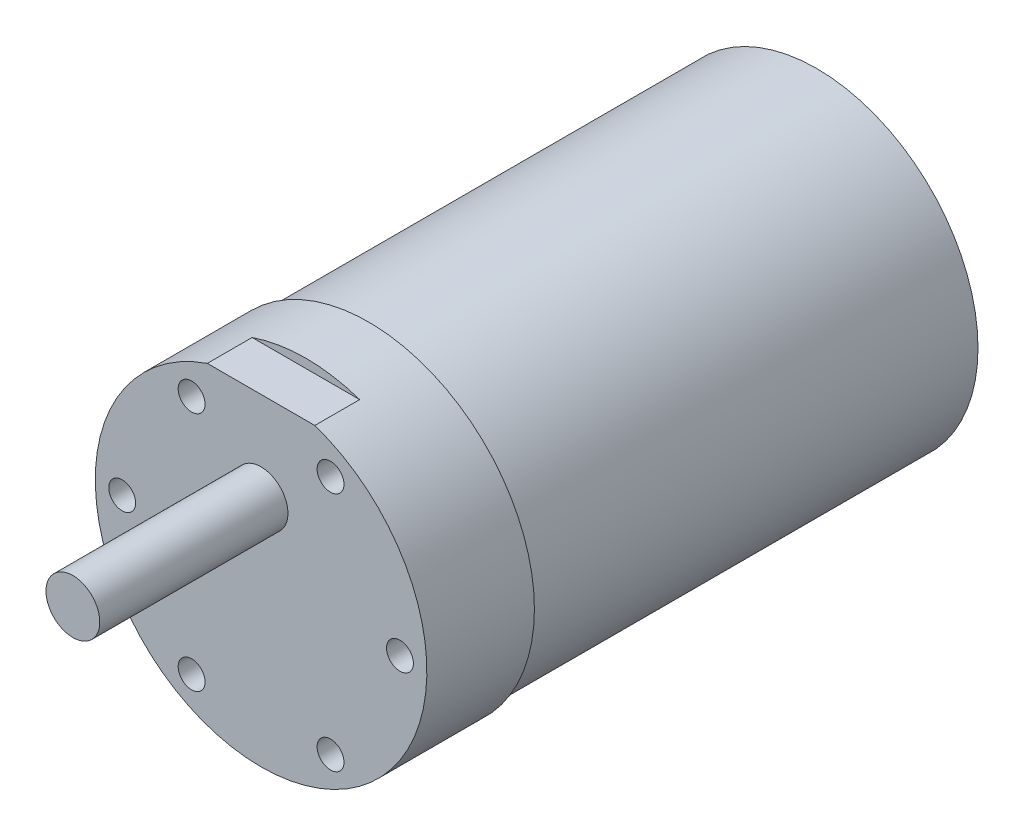
ISO-10303-21;
HEADER;
FILE_DESCRIPTION(('STEP AP214'),'2;1');
FILE_NAME('part.step','',(''),(''),'','','');
FILE_SCHEMA(('AUTOMOTIVE_DESIGN { 1 0 10303 214 1 1 1 1 }'));
ENDSEC;
DATA;
#1=APPLICATION_CONTEXT('core data for automotive mechanical design processes');
#2=APPLICATION_PROTOCOL_DEFINITION('international standard','automotive_design',2000,#1);
#3=PRODUCT_CONTEXT('',#1,'mechanical');
#4=PRODUCT('Part','Part','',(#3));
#5=PRODUCT_RELATED_PRODUCT_CATEGORY('part','',(#4));
#6=PRODUCT_DEFINITION_FORMATION('','',#4);
#7=PRODUCT_DEFINITION_CONTEXT('part definition',#1,'design');
#8=PRODUCT_DEFINITION('design','',#6,#7);
#9=PRODUCT_DEFINITION_SHAPE('','',#8);
#10=(LENGTH_UNIT() NAMED_UNIT(*) SI_UNIT(.MILLI.,.METRE.));
#11=(NAMED_UNIT(*) PLANE_ANGLE_UNIT() SI_UNIT($,.RADIAN.));
#12=(NAMED_UNIT(*) SI_UNIT($,.STERADIAN.) SOLID_ANGLE_UNIT());
#13=UNCERTAINTY_MEASURE_WITH_UNIT(LENGTH_MEASURE(1.E-05),#10,'distance_accuracy_value','');
#14=(GEOMETRIC_REPRESENTATION_CONTEXT(3) GLOBAL_UNCERTAINTY_ASSIGNED_CONTEXT((#13)) GLOBAL_UNIT_ASSIGNED_CONTEXT((#10,
#11,#12)) REPRESENTATION_CONTEXT('',''));
#15=CARTESIAN_POINT('',(0.,0.,0.));
#16=DIRECTION('',(0.,0.,1.));
#17=DIRECTION('',(1.,0.,0.));
#18=AXIS2_PLACEMENT_3D('',#15,#16,#17);
#19=CARTESIAN_POINT('',(6.10211523040816,32.8501846464901,8.33257732777867));
#20=DIRECTION('',(0.,0.,1.));
#21=DIRECTION('',(1.,0.,0.));
#22=AXIS2_PLACEMENT_3D('',#19,#20,#21);
#23=PLANE('',#22);
#24=DIRECTION('',(1.,0.,0.));
#25=VECTOR('',#24,1.);
#26=CARTESIAN_POINT('',(0.732253827648978,48.2501846464901,8.33257732777867));
#27=LINE('',#26,#25);
#28=CARTESIAN_POINT('',(0.822115230408154,48.2501846464901,8.33257732777867));
#29=VERTEX_POINT('',#28);
#30=CARTESIAN_POINT('',(11.3821152304082,48.2501846464901,8.33257732777867));
#31=VERTEX_POINT('',#30);
#32=EDGE_CURVE('E66',#29,#31,#27,.T.);
#33=ORIENTED_EDGE('',*,*,#32,.F.);
#34=CARTESIAN_POINT('',(6.10211523040816,32.8501846464901,8.33257732777867));
#35=DIRECTION('',(0.,0.,1.));
#36=DIRECTION('',(1.,0.,0.));
#37=AXIS2_PLACEMENT_3D('',#34,#35,#36);
#38=CIRCLE('',#37,16.28);
#39=EDGE_CURVE('E44',#29,#31,#38,.T.);
#40=ORIENTED_EDGE('',*,*,#39,.T.);
#41=EDGE_LOOP('',(#33,#40));
#42=FACE_BOUND('',#41,.T.);
#43=CARTESIAN_POINT('',(6.10211523040816,39.4501846464901,8.33257732777867));
#44=DIRECTION('',(0.,0.,1.));
#45=DIRECTION('',(1.,0.,0.));
#46=AXIS2_PLACEMENT_3D('',#43,#44,#45);
#47=CIRCLE('',#46,2.64);
#48=CARTESIAN_POINT('',(3.46211523040816,39.4501846464901,8.33257732777866));
#49=VERTEX_POINT('',#48);
#50=EDGE_CURVE('E119',#49,#49,#47,.T.);
#51=ORIENTED_EDGE('',*,*,#50,.F.);
#52=EDGE_LOOP('',(#51));
#53=FACE_BOUND('',#52,.T.);
#54=CARTESIAN_POINT('',(12.9221152304083,44.6627711541098,8.33257732777867));
#55=DIRECTION('',(0.,0.,1.));
#56=DIRECTION('',(1.,0.,0.));
#57=AXIS2_PLACEMENT_3D('',#54,#55,#56);
#58=CIRCLE('',#57,1.32);
#59=CARTESIAN_POINT('',(14.2421152304083,44.6627711541098,8.33257732777867));
#60=VERTEX_POINT('',#59);
#61=EDGE_CURVE('E107',#60,#60,#58,.T.);
#62=ORIENTED_EDGE('',*,*,#61,.F.);
#63=EDGE_LOOP('',(#62));
#64=FACE_BOUND('',#63,.T.);
#65=CARTESIAN_POINT('',(-7.53788476959184,32.8501846464902,8.33257732777867));
#66=DIRECTION('',(0.,0.,1.));
#67=DIRECTION('',(1.,0.,0.));
#68=AXIS2_PLACEMENT_3D('',#65,#66,#67);
#69=CIRCLE('',#68,1.32);
#70=CARTESIAN_POINT('',(-6.21788476959184,32.8501846464902,8.33257732777867));
#71=VERTEX_POINT('',#70);
#72=EDGE_CURVE('E95',#71,#71,#69,.T.);
#73=ORIENTED_EDGE('',*,*,#72,.F.);
#74=EDGE_LOOP('',(#73));
#75=FACE_BOUND('',#74,.T.);
#76=CARTESIAN_POINT('',(12.9221152304081,21.0375981388703,8.33257732777867));
#77=DIRECTION('',(0.,0.,1.));
#78=DIRECTION('',(1.,0.,0.));
#79=AXIS2_PLACEMENT_3D('',#76,#77,#78);
#80=CIRCLE('',#79,1.32);
#81=CARTESIAN_POINT('',(14.2421152304081,21.0375981388703,8.33257732777867));
#82=VERTEX_POINT('',#81);
#83=EDGE_CURVE('E83',#82,#82,#80,.T.);
#84=ORIENTED_EDGE('',*,*,#83,.F.);
#85=EDGE_LOOP('',(#84));
#86=FACE_BOUND('',#85,.T.);
#87=CARTESIAN_POINT('',(19.7421152304082,32.8501846464901,8.33257732777867));
#88=DIRECTION('',(0.,0.,1.));
#89=DIRECTION('',(1.,0.,0.));
#90=AXIS2_PLACEMENT_3D('',#87,#88,#89);
#91=CIRCLE('',#90,1.32);
#92=CARTESIAN_POINT('',(21.0621152304082,32.8501846464901,8.33257732777867));
#93=VERTEX_POINT('',#92);
#94=EDGE_CURVE('E78',#93,#93,#91,.T.);
#95=ORIENTED_EDGE('',*,*,#94,.F.);
#96=EDGE_LOOP('',(#95));
#97=FACE_BOUND('',#96,.T.);
#98=CARTESIAN_POINT('',(-0.7178847695919,21.0375981388704,8.33257732777867));
#99=DIRECTION('',(0.,0.,1.));
#100=DIRECTION('',(1.,0.,0.));
#101=AXIS2_PLACEMENT_3D('',#98,#99,#100);
#102=CIRCLE('',#101,1.32);
#103=CARTESIAN_POINT('',(0.602115230408101,21.0375981388704,8.33257732777867));
#104=VERTEX_POINT('',#103);
#105=EDGE_CURVE('E89',#104,#104,#102,.T.);
#106=ORIENTED_EDGE('',*,*,#105,.F.);
#107=EDGE_LOOP('',(#106));
#108=FACE_BOUND('',#107,.T.);
#109=CARTESIAN_POINT('',(-0.717884769591742,44.6627711541099,8.33257732777867));
#110=DIRECTION('',(0.,0.,1.));
#111=DIRECTION('',(1.,0.,0.));
#112=AXIS2_PLACEMENT_3D('',#109,#110,#111);
#113=CIRCLE('',#112,1.32);
#114=CARTESIAN_POINT('',(0.602115230408256,44.6627711541099,8.33257732777867));
#115=VERTEX_POINT('',#114);
#116=EDGE_CURVE('E101',#115,#115,#113,.T.);
#117=ORIENTED_EDGE('',*,*,#116,.F.);
#118=EDGE_LOOP('',(#117));
#119=FACE_BOUND('',#118,.T.);
#120=ADVANCED_FACE('F35',(#42,#53,#64,#75,#86,#97,#108,#119),#23,.T.);
#121=CARTESIAN_POINT('',(6.10211523040816,32.8501846464901,-2.22742267222134));
#122=DIRECTION('',(0.,0.,1.));
#123=DIRECTION('',(1.,0.,0.));
#124=AXIS2_PLACEMENT_3D('',#121,#122,#123);
#125=PLANE('',#124);
#126=CARTESIAN_POINT('',(6.10211523040816,32.8501846464901,-2.22742267222134));
#127=DIRECTION('',(0.,0.,-1.));
#128=DIRECTION('',(-1.,0.,0.));
#129=AXIS2_PLACEMENT_3D('',#126,#127,#128);
#130=CIRCLE('',#129,15.84);
#131=CARTESIAN_POINT('',(-9.73788476959184,32.8501846464901,-2.22742267222134));
#132=VERTEX_POINT('',#131);
#133=EDGE_CURVE('E11',#132,#132,#130,.T.);
#134=ORIENTED_EDGE('',*,*,#133,.F.);
#135=EDGE_LOOP('',(#134));
#136=FACE_BOUND('',#135,.T.);
#137=CARTESIAN_POINT('',(6.10211523040816,32.8501846464901,-2.22742267222134));
#138=DIRECTION('',(0.,0.,1.));
#139=DIRECTION('',(1.,0.,0.));
#140=AXIS2_PLACEMENT_3D('',#137,#138,#139);
#141=CIRCLE('',#140,16.28);
#142=CARTESIAN_POINT('',(22.3821152304082,32.8501846464901,-2.22742267222134));
#143=VERTEX_POINT('',#142);
#144=EDGE_CURVE('E39',#143,#143,#141,.T.);
#145=ORIENTED_EDGE('',*,*,#144,.F.);
#146=EDGE_LOOP('',(#145));
#147=FACE_BOUND('',#146,.T.);
#148=ADVANCED_FACE('F138',(#136,#147),#125,.F.);
#149=CARTESIAN_POINT('',(6.10211523040816,32.8501846464901,8.33257732777867));
#150=DIRECTION('',(0.,0.,-1.));
#151=DIRECTION('',(-1.,0.,0.));
#152=AXIS2_PLACEMENT_3D('',#149,#150,#151);
#153=CYLINDRICAL_SURFACE('',#152,16.28);
#154=ORIENTED_EDGE('',*,*,#39,.F.);
#155=DIRECTION('',(0.,0.,1.));
#156=VECTOR('',#155,1.);
#157=CARTESIAN_POINT('',(0.822115230408154,48.2501846464901,3.93257732777866));
#158=LINE('',#157,#156);
#159=CARTESIAN_POINT('',(0.822115230408154,48.2501846464901,3.93257732777866));
#160=VERTEX_POINT('',#159);
#161=EDGE_CURVE('E63',#160,#29,#158,.T.);
#162=ORIENTED_EDGE('',*,*,#161,.F.);
#163=CARTESIAN_POINT('',(6.10211523040816,32.8501846464901,3.93257732777866));
#164=DIRECTION('',(0.,0.,1.));
#165=DIRECTION('',(1.,0.,0.));
#166=AXIS2_PLACEMENT_3D('',#163,#164,#165);
#167=CIRCLE('',#166,16.28);
#168=CARTESIAN_POINT('',(11.3821152304082,48.2501846464901,3.93257732777866));
#169=VERTEX_POINT('',#168);
#170=EDGE_CURVE('E56',#169,#160,#167,.T.);
#171=ORIENTED_EDGE('',*,*,#170,.F.);
#172=DIRECTION('',(0.,0.,1.));
#173=VECTOR('',#172,1.);
#174=CARTESIAN_POINT('',(11.3821152304082,48.2501846464901,3.93257732777866));
#175=LINE('',#174,#173);
#176=EDGE_CURVE('E70',#169,#31,#175,.T.);
#177=ORIENTED_EDGE('',*,*,#176,.T.);
#178=EDGE_LOOP('',(#154,#162,#171,#177));
#179=FACE_BOUND('',#178,.T.);
#180=ORIENTED_EDGE('',*,*,#144,.T.);
#181=EDGE_LOOP('',(#180));
#182=FACE_BOUND('',#181,.T.);
#183=ADVANCED_FACE('F37',(#179,#182),#153,.T.);
#184=CARTESIAN_POINT('',(19.7421152304082,32.8501846464901,8.33257732777867));
#185=DIRECTION('',(0.,0.,-1.));
#186=DIRECTION('',(-1.,0.,0.));
#187=AXIS2_PLACEMENT_3D('',#184,#185,#186);
#188=CYLINDRICAL_SURFACE('',#187,1.32);
#189=ORIENTED_EDGE('',*,*,#94,.T.);
#190=EDGE_LOOP('',(#189));
#191=FACE_BOUND('',#190,.T.);
#192=CARTESIAN_POINT('',(19.7421152304082,32.8501846464901,-2.22742267222134));
#193=DIRECTION('',(0.,0.,1.));
#194=DIRECTION('',(1.,0.,0.));
#195=AXIS2_PLACEMENT_3D('',#192,#193,#194);
#196=CIRCLE('',#195,1.32);
#197=CARTESIAN_POINT('',(21.0621152304082,32.8501846464901,-2.22742267222134));
#198=VERTEX_POINT('',#197);
#199=EDGE_CURVE('E80',#198,#198,#196,.T.);
#200=ORIENTED_EDGE('',*,*,#199,.F.);
#201=EDGE_LOOP('',(#200));
#202=FACE_BOUND('',#201,.T.);
#203=ADVANCED_FACE('F195',(#191,#202),#188,.F.);
#204=CARTESIAN_POINT('',(12.9221152304081,21.0375981388703,8.33257732777867));
#205=DIRECTION('',(0.,0.,-1.));
#206=DIRECTION('',(-1.,0.,0.));
#207=AXIS2_PLACEMENT_3D('',#204,#205,#206);
#208=CYLINDRICAL_SURFACE('',#207,1.32);
#209=ORIENTED_EDGE('',*,*,#83,.T.);
#210=EDGE_LOOP('',(#209));
#211=FACE_BOUND('',#210,.T.);
#212=CARTESIAN_POINT('',(12.9221152304081,21.0375981388703,-2.22742267222134));
#213=DIRECTION('',(0.,0.,1.));
#214=DIRECTION('',(1.,0.,0.));
#215=AXIS2_PLACEMENT_3D('',#212,#213,#214);
#216=CIRCLE('',#215,1.32);
#217=CARTESIAN_POINT('',(14.2421152304081,21.0375981388703,-2.22742267222134));
#218=VERTEX_POINT('',#217);
#219=EDGE_CURVE('E86',#218,#218,#216,.T.);
#220=ORIENTED_EDGE('',*,*,#219,.F.);
#221=EDGE_LOOP('',(#220));
#222=FACE_BOUND('',#221,.T.);
#223=ADVANCED_FACE('F191',(#211,#222),#208,.F.);
#224=CARTESIAN_POINT('',(-0.7178847695919,21.0375981388704,8.33257732777867));
#225=DIRECTION('',(0.,0.,-1.));
#226=DIRECTION('',(-1.,0.,0.));
#227=AXIS2_PLACEMENT_3D('',#224,#225,#226);
#228=CYLINDRICAL_SURFACE('',#227,1.32);
#229=ORIENTED_EDGE('',*,*,#105,.T.);
#230=EDGE_LOOP('',(#229));
#231=FACE_BOUND('',#230,.T.);
#232=CARTESIAN_POINT('',(-0.7178847695919,21.0375981388704,-2.22742267222134));
#233=DIRECTION('',(0.,0.,1.));
#234=DIRECTION('',(1.,0.,0.));
#235=AXIS2_PLACEMENT_3D('',#232,#233,#234);
#236=CIRCLE('',#235,1.32);
#237=CARTESIAN_POINT('',(0.602115230408101,21.0375981388704,-2.22742267222134));
#238=VERTEX_POINT('',#237);
#239=EDGE_CURVE('E92',#238,#238,#236,.T.);
#240=ORIENTED_EDGE('',*,*,#239,.F.);
#241=EDGE_LOOP('',(#240));
#242=FACE_BOUND('',#241,.T.);
#243=ADVANCED_FACE('F187',(#231,#242),#228,.F.);
#244=CARTESIAN_POINT('',(-7.53788476959184,32.8501846464902,8.33257732777867));
#245=DIRECTION('',(0.,0.,-1.));
#246=DIRECTION('',(-1.,0.,0.));
#247=AXIS2_PLACEMENT_3D('',#244,#245,#246);
#248=CYLINDRICAL_SURFACE('',#247,1.32);
#249=ORIENTED_EDGE('',*,*,#72,.T.);
#250=EDGE_LOOP('',(#249));
#251=FACE_BOUND('',#250,.T.);
#252=CARTESIAN_POINT('',(-7.53788476959184,32.8501846464902,-2.22742267222134));
#253=DIRECTION('',(0.,0.,1.));
#254=DIRECTION('',(1.,0.,0.));
#255=AXIS2_PLACEMENT_3D('',#252,#253,#254);
#256=CIRCLE('',#255,1.32);
#257=CARTESIAN_POINT('',(-6.21788476959184,32.8501846464902,-2.22742267222134));
#258=VERTEX_POINT('',#257);
#259=EDGE_CURVE('E98',#258,#258,#256,.T.);
#260=ORIENTED_EDGE('',*,*,#259,.F.);
#261=EDGE_LOOP('',(#260));
#262=FACE_BOUND('',#261,.T.);
#263=ADVANCED_FACE('F156',(#251,#262),#248,.F.);
#264=CARTESIAN_POINT('',(-0.717884769591742,44.6627711541099,8.33257732777867));
#265=DIRECTION('',(0.,0.,-1.));
#266=DIRECTION('',(-1.,0.,0.));
#267=AXIS2_PLACEMENT_3D('',#264,#265,#266);
#268=CYLINDRICAL_SURFACE('',#267,1.32);
#269=ORIENTED_EDGE('',*,*,#116,.T.);
#270=EDGE_LOOP('',(#269));
#271=FACE_BOUND('',#270,.T.);
#272=CARTESIAN_POINT('',(-0.717884769591742,44.6627711541099,-2.22742267222134));
#273=DIRECTION('',(0.,0.,1.));
#274=DIRECTION('',(1.,0.,0.));
#275=AXIS2_PLACEMENT_3D('',#272,#273,#274);
#276=CIRCLE('',#275,1.32);
#277=CARTESIAN_POINT('',(0.602115230408256,44.6627711541099,-2.22742267222134));
#278=VERTEX_POINT('',#277);
#279=EDGE_CURVE('E104',#278,#278,#276,.T.);
#280=ORIENTED_EDGE('',*,*,#279,.F.);
#281=EDGE_LOOP('',(#280));
#282=FACE_BOUND('',#281,.T.);
#283=ADVANCED_FACE('F152',(#271,#282),#268,.F.);
#284=CARTESIAN_POINT('',(12.9221152304083,44.6627711541098,8.33257732777867));
#285=DIRECTION('',(0.,0.,-1.));
#286=DIRECTION('',(-1.,0.,0.));
#287=AXIS2_PLACEMENT_3D('',#284,#285,#286);
#288=CYLINDRICAL_SURFACE('',#287,1.32);
#289=ORIENTED_EDGE('',*,*,#61,.T.);
#290=EDGE_LOOP('',(#289));
#291=FACE_BOUND('',#290,.T.);
#292=CARTESIAN_POINT('',(12.9221152304083,44.6627711541098,-2.22742267222134));
#293=DIRECTION('',(0.,0.,1.));
#294=DIRECTION('',(1.,0.,0.));
#295=AXIS2_PLACEMENT_3D('',#292,#293,#294);
#296=CIRCLE('',#295,1.32);
#297=CARTESIAN_POINT('',(14.2421152304083,44.6627711541098,-2.22742267222134));
#298=VERTEX_POINT('',#297);
#299=EDGE_CURVE('E110',#298,#298,#296,.T.);
#300=ORIENTED_EDGE('',*,*,#299,.F.);
#301=EDGE_LOOP('',(#300));
#302=FACE_BOUND('',#301,.T.);
#303=ADVANCED_FACE('F155',(#291,#302),#288,.F.);
#304=CARTESIAN_POINT('',(6.10211523040816,32.8501846464901,-46.2274226722213));
#305=DIRECTION('',(0.,0.,-1.));
#306=DIRECTION('',(-1.,0.,0.));
#307=AXIS2_PLACEMENT_3D('',#304,#305,#306);
#308=PLANE('',#307);
#309=CARTESIAN_POINT('',(6.10211523040816,32.8501846464901,-46.2274226722213));
#310=DIRECTION('',(0.,0.,-1.));
#311=DIRECTION('',(-1.,0.,0.));
#312=AXIS2_PLACEMENT_3D('',#309,#310,#311);
#313=CIRCLE('',#312,15.84);
#314=CARTESIAN_POINT('',(-9.73788476959184,32.8501846464901,-46.2274226722213));
#315=VERTEX_POINT('',#314);
#316=EDGE_CURVE('E113',#315,#315,#313,.T.);
#317=ORIENTED_EDGE('',*,*,#316,.T.);
#318=EDGE_LOOP('',(#317));
#319=FACE_BOUND('',#318,.T.);
#320=ADVANCED_FACE('F178',(#319),#308,.T.);
#321=CARTESIAN_POINT('',(6.10211523040816,32.8501846464901,-46.2274226722213));
#322=DIRECTION('',(0.,0.,1.));
#323=DIRECTION('',(1.,0.,0.));
#324=AXIS2_PLACEMENT_3D('',#321,#322,#323);
#325=CYLINDRICAL_SURFACE('',#324,15.84);
#326=ORIENTED_EDGE('',*,*,#316,.F.);
#327=EDGE_LOOP('',(#326));
#328=FACE_BOUND('',#327,.T.);
#329=ORIENTED_EDGE('',*,*,#133,.T.);
#330=EDGE_LOOP('',(#329));
#331=FACE_BOUND('',#330,.T.);
#332=ADVANCED_FACE('F171',(#328,#331),#325,.T.);
#333=CARTESIAN_POINT('',(6.10211523040816,32.8501846464901,-2.22742267222134));
#334=DIRECTION('',(0.,0.,-1.));
#335=DIRECTION('',(-1.,0.,0.));
#336=AXIS2_PLACEMENT_3D('',#333,#334,#335);
#337=PLANE('',#336);
#338=ORIENTED_EDGE('',*,*,#299,.T.);
#339=EDGE_LOOP('',(#338));
#340=FACE_BOUND('',#339,.T.);
#341=ADVANCED_FACE('F163',(#340),#337,.F.);
#342=ORIENTED_EDGE('',*,*,#279,.T.);
#343=EDGE_LOOP('',(#342));
#344=FACE_BOUND('',#343,.T.);
#345=ADVANCED_FACE('F160',(#344),#337,.F.);
#346=ORIENTED_EDGE('',*,*,#259,.T.);
#347=EDGE_LOOP('',(#346));
#348=FACE_BOUND('',#347,.T.);
#349=ADVANCED_FACE('F162',(#348),#337,.F.);
#350=ORIENTED_EDGE('',*,*,#239,.T.);
#351=EDGE_LOOP('',(#350));
#352=FACE_BOUND('',#351,.T.);
#353=ADVANCED_FACE('F169',(#352),#337,.F.);
#354=ORIENTED_EDGE('',*,*,#219,.T.);
#355=EDGE_LOOP('',(#354));
#356=FACE_BOUND('',#355,.T.);
#357=ADVANCED_FACE('F176',(#356),#337,.F.);
#358=ORIENTED_EDGE('',*,*,#199,.T.);
#359=EDGE_LOOP('',(#358));
#360=FACE_BOUND('',#359,.T.);
#361=ADVANCED_FACE('F133',(#360),#337,.F.);
#362=CARTESIAN_POINT('',(6.10211523040816,39.4501846464901,26.8125773277787));
#363=DIRECTION('',(0.,0.,-1.));
#364=DIRECTION('',(-1.,0.,0.));
#365=AXIS2_PLACEMENT_3D('',#362,#363,#364);
#366=CYLINDRICAL_SURFACE('',#365,2.64);
#367=CARTESIAN_POINT('',(6.10211523040816,39.4501846464901,26.8125773277787));
#368=DIRECTION('',(0.,0.,1.));
#369=DIRECTION('',(1.,0.,0.));
#370=AXIS2_PLACEMENT_3D('',#367,#368,#369);
#371=CIRCLE('',#370,2.64);
#372=CARTESIAN_POINT('',(3.46211523040816,39.4501846464901,26.8125773277787));
#373=VERTEX_POINT('',#372);
#374=EDGE_CURVE('E118',#373,#373,#371,.T.);
#375=CARTESIAN_POINT('',(3.46211523040816,39.4501846464901,26.8125773277787));
#376=CARTESIAN_POINT('',(3.46211523040816,39.4501846464901,26.6200773277787));
#377=CARTESIAN_POINT('',(3.46211523040816,39.4501846464901,26.4275773277787));
#378=CARTESIAN_POINT('',(3.46211523040816,39.4501846464901,26.0425773277787));
#379=CARTESIAN_POINT('',(3.46211523040816,39.4501846464901,25.8500773277787));
#380=CARTESIAN_POINT('',(3.46211523040816,39.4501846464901,25.4650773277787));
#381=CARTESIAN_POINT('',(3.46211523040816,39.4501846464901,25.2725773277787));
#382=CARTESIAN_POINT('',(3.46211523040816,39.4501846464901,24.8875773277787));
#383=CARTESIAN_POINT('',(3.46211523040816,39.4501846464901,24.6950773277787));
#384=CARTESIAN_POINT('',(3.46211523040816,39.4501846464901,24.3100773277787));
#385=CARTESIAN_POINT('',(3.46211523040816,39.4501846464901,24.1175773277787));
#386=CARTESIAN_POINT('',(3.46211523040816,39.4501846464901,23.7325773277787));
#387=CARTESIAN_POINT('',(3.46211523040816,39.4501846464901,23.5400773277787));
#388=CARTESIAN_POINT('',(3.46211523040816,39.4501846464901,23.1550773277787));
#389=CARTESIAN_POINT('',(3.46211523040816,39.4501846464901,22.9625773277787));
#390=CARTESIAN_POINT('',(3.46211523040816,39.4501846464901,22.5775773277787));
#391=CARTESIAN_POINT('',(3.46211523040816,39.4501846464901,22.3850773277787));
#392=CARTESIAN_POINT('',(3.46211523040816,39.4501846464901,22.0000773277787));
#393=CARTESIAN_POINT('',(3.46211523040816,39.4501846464901,21.8075773277787));
#394=CARTESIAN_POINT('',(3.46211523040816,39.4501846464901,21.4225773277787));
#395=CARTESIAN_POINT('',(3.46211523040816,39.4501846464901,21.2300773277787));
#396=CARTESIAN_POINT('',(3.46211523040816,39.4501846464901,20.8450773277787));
#397=CARTESIAN_POINT('',(3.46211523040816,39.4501846464901,20.6525773277787));
#398=CARTESIAN_POINT('',(3.46211523040816,39.4501846464901,20.2675773277787));
#399=CARTESIAN_POINT('',(3.46211523040816,39.4501846464901,20.0750773277787));
#400=CARTESIAN_POINT('',(3.46211523040816,39.4501846464901,19.6900773277787));
#401=CARTESIAN_POINT('',(3.46211523040816,39.4501846464901,19.4975773277787));
#402=CARTESIAN_POINT('',(3.46211523040816,39.4501846464901,19.1125773277787));
#403=CARTESIAN_POINT('',(3.46211523040816,39.4501846464901,18.9200773277787));
#404=CARTESIAN_POINT('',(3.46211523040816,39.4501846464901,18.5350773277787));
#405=CARTESIAN_POINT('',(3.46211523040816,39.4501846464901,18.3425773277787));
#406=CARTESIAN_POINT('',(3.46211523040816,39.4501846464901,17.9575773277787));
#407=CARTESIAN_POINT('',(3.46211523040816,39.4501846464901,17.7650773277787));
#408=CARTESIAN_POINT('',(3.46211523040816,39.4501846464901,17.3800773277787));
#409=CARTESIAN_POINT('',(3.46211523040816,39.4501846464901,17.1875773277787));
#410=CARTESIAN_POINT('',(3.46211523040816,39.4501846464901,16.8025773277787));
#411=CARTESIAN_POINT('',(3.46211523040816,39.4501846464901,16.6100773277787));
#412=CARTESIAN_POINT('',(3.46211523040816,39.4501846464901,16.2250773277787));
#413=CARTESIAN_POINT('',(3.46211523040816,39.4501846464901,16.0325773277787));
#414=CARTESIAN_POINT('',(3.46211523040816,39.4501846464901,15.6475773277787));
#415=CARTESIAN_POINT('',(3.46211523040816,39.4501846464901,15.4550773277787));
#416=CARTESIAN_POINT('',(3.46211523040816,39.4501846464901,15.0700773277787));
#417=CARTESIAN_POINT('',(3.46211523040816,39.4501846464901,14.8775773277787));
#418=CARTESIAN_POINT('',(3.46211523040816,39.4501846464901,14.4925773277787));
#419=CARTESIAN_POINT('',(3.46211523040816,39.4501846464901,14.3000773277787));
#420=CARTESIAN_POINT('',(3.46211523040816,39.4501846464901,13.9150773277787));
#421=CARTESIAN_POINT('',(3.46211523040816,39.4501846464901,13.7225773277787));
#422=CARTESIAN_POINT('',(3.46211523040816,39.4501846464901,13.3375773277787));
#423=CARTESIAN_POINT('',(3.46211523040816,39.4501846464901,13.1450773277787));
#424=CARTESIAN_POINT('',(3.46211523040816,39.4501846464901,12.7600773277787));
#425=CARTESIAN_POINT('',(3.46211523040816,39.4501846464901,12.5675773277787));
#426=CARTESIAN_POINT('',(3.46211523040816,39.4501846464901,12.1825773277787));
#427=CARTESIAN_POINT('',(3.46211523040816,39.4501846464901,11.9900773277787));
#428=CARTESIAN_POINT('',(3.46211523040816,39.4501846464901,11.6050773277787));
#429=CARTESIAN_POINT('',(3.46211523040816,39.4501846464901,11.4125773277787));
#430=CARTESIAN_POINT('',(3.46211523040816,39.4501846464901,11.0275773277787));
#431=CARTESIAN_POINT('',(3.46211523040816,39.4501846464901,10.8350773277787));
#432=CARTESIAN_POINT('',(3.46211523040816,39.4501846464901,10.4500773277787));
#433=CARTESIAN_POINT('',(3.46211523040816,39.4501846464901,10.2575773277787));
#434=CARTESIAN_POINT('',(3.46211523040816,39.4501846464901,9.87257732777866));
#435=CARTESIAN_POINT('',(3.46211523040816,39.4501846464901,9.68007732777866));
#436=CARTESIAN_POINT('',(3.46211523040816,39.4501846464901,9.29507732777866));
#437=CARTESIAN_POINT('',(3.46211523040816,39.4501846464901,9.10257732777866));
#438=CARTESIAN_POINT('',(3.46211523040816,39.4501846464901,8.71757732777867));
#439=CARTESIAN_POINT('',(3.46211523040816,39.4501846464901,8.52507732777866));
#440=CARTESIAN_POINT('',(3.46211523040816,39.4501846464901,8.33257732777866));
#441=B_SPLINE_CURVE_WITH_KNOTS('',3,(#375,#376,#377,#378,#379,#380,#381,#382,#383,#384,#385,
#386,#387,#388,#389,#390,#391,#392,#393,#394,#395,#396,#397,#398,#399,#400,#401,#402,#403,#404,
#405,#406,#407,#408,#409,#410,#411,#412,#413,#414,#415,#416,#417,#418,#419,#420,#421,#422,#423,
#424,#425,#426,#427,#428,#429,#430,#431,#432,#433,#434,#435,#436,#437,#438,#439,#440),
.UNSPECIFIED.,.F.,.F.,(4,2,2,2,2,2,2,2,2,2,2,2,2,2,2,2,2,2,2,2,2,2,2,2,2,2,2,2,2,2,2,2,4),(0.,
0.577500000000002,1.155,1.7325,2.31,2.8875,3.465,4.0425,4.62,5.1975,5.775,6.3525,
6.93000000000001,7.5075,8.08500000000001,8.6625,9.24000000000001,9.81750000000001,10.395,
10.9725,11.55,12.1275,12.705,13.2825,13.86,14.4375,15.015,15.5925,16.17,16.7475,17.325,17.9025,
18.48),.UNSPECIFIED.);
#442=EDGE_CURVE('BSEAM130',#373,#49,#441,.T.);
#443=ORIENTED_EDGE('',*,*,#374,.F.);
#444=ORIENTED_EDGE('',*,*,#50,.T.);
#445=ORIENTED_EDGE('',*,*,#442,.T.);
#446=ORIENTED_EDGE('',*,*,#442,.F.);
#447=EDGE_LOOP('',(#443,#445,#444,#446));
#448=FACE_BOUND('',#447,.T.);
#449=ADVANCED_FACE('F130',(#448),#366,.T.);
#450=CARTESIAN_POINT('',(6.10211523040816,39.4501846464901,26.8125773277787));
#451=DIRECTION('',(0.,0.,1.));
#452=DIRECTION('',(1.,0.,0.));
#453=AXIS2_PLACEMENT_3D('',#450,#451,#452);
#454=PLANE('',#453);
#455=ORIENTED_EDGE('',*,*,#374,.T.);
#456=EDGE_LOOP('',(#455));
#457=FACE_BOUND('',#456,.T.);
#458=ADVANCED_FACE('F128',(#457),#454,.T.);
#459=CARTESIAN_POINT('',(0.732253827648978,48.2501846464901,3.93257732777866));
#460=DIRECTION('',(0.,-1.,0.));
#461=DIRECTION('',(0.,0.,-1.));
#462=AXIS2_PLACEMENT_3D('',#459,#460,#461);
#463=PLANE('',#462);
#464=ORIENTED_EDGE('',*,*,#32,.T.);
#465=ORIENTED_EDGE('',*,*,#176,.F.);
#466=DIRECTION('',(1.,0.,0.));
#467=VECTOR('',#466,1.);
#468=CARTESIAN_POINT('',(0.732253827648978,48.2501846464901,3.93257732777866));
#469=LINE('',#468,#467);
#470=EDGE_CURVE('E51',#160,#169,#469,.T.);
#471=ORIENTED_EDGE('',*,*,#470,.F.);
#472=ORIENTED_EDGE('',*,*,#161,.T.);
#473=EDGE_LOOP('',(#464,#465,#471,#472));
#474=FACE_BOUND('',#473,.T.);
#475=ADVANCED_FACE('F65',(#474),#463,.F.);
#476=CARTESIAN_POINT('',(0.732253827648978,3.94819729882787,3.93257732777866));
#477=DIRECTION('',(0.,0.,1.));
#478=DIRECTION('',(1.,0.,0.));
#479=AXIS2_PLACEMENT_3D('',#476,#477,#478);
#480=PLANE('',#479);
#481=ORIENTED_EDGE('',*,*,#170,.T.);
#482=ORIENTED_EDGE('',*,*,#470,.T.);
#483=EDGE_LOOP('',(#481,#482));
#484=FACE_BOUND('',#483,.T.);
#485=ADVANCED_FACE('F304',(#484),#480,.T.);
#486=CLOSED_SHELL('',(#120,#148,#183,#203,#223,#243,#263,#283,#303,#320,#332,#341,#345,#349,
#353,#357,#361,#449,#458,#475,#485));
#487=MANIFOLD_SOLID_BREP('B2',#486);
#488=ADVANCED_BREP_SHAPE_REPRESENTATION('',(#18,#487),#14);
#489=SHAPE_DEFINITION_REPRESENTATION(#9,#488);
ENDSEC;
END-ISO-10303-21;
